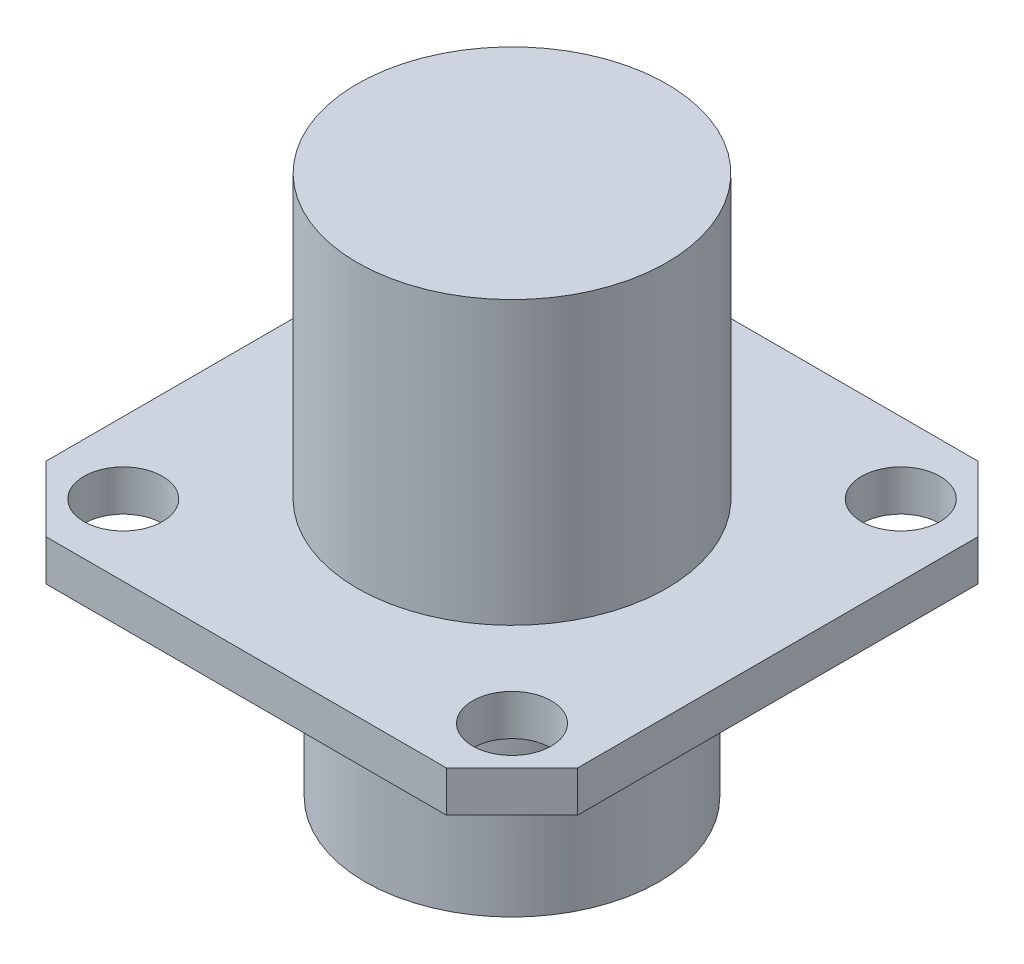
ISO-10303-21;
HEADER;
FILE_DESCRIPTION(('STEP AP214'),'2;1');
FILE_NAME('part.step','',(''),(''),'','','');
FILE_SCHEMA(('AUTOMOTIVE_DESIGN { 1 0 10303 214 1 1 1 1 }'));
ENDSEC;
DATA;
#1=APPLICATION_CONTEXT('core data for automotive mechanical design processes');
#2=APPLICATION_PROTOCOL_DEFINITION('international standard','automotive_design',2000,#1);
#3=PRODUCT_CONTEXT('',#1,'mechanical');
#4=PRODUCT('Part','Part','',(#3));
#5=PRODUCT_RELATED_PRODUCT_CATEGORY('part','',(#4));
#6=PRODUCT_DEFINITION_FORMATION('','',#4);
#7=PRODUCT_DEFINITION_CONTEXT('part definition',#1,'design');
#8=PRODUCT_DEFINITION('design','',#6,#7);
#9=PRODUCT_DEFINITION_SHAPE('','',#8);
#10=(LENGTH_UNIT() NAMED_UNIT(*) SI_UNIT(.MILLI.,.METRE.));
#11=(NAMED_UNIT(*) PLANE_ANGLE_UNIT() SI_UNIT($,.RADIAN.));
#12=(NAMED_UNIT(*) SI_UNIT($,.STERADIAN.) SOLID_ANGLE_UNIT());
#13=UNCERTAINTY_MEASURE_WITH_UNIT(LENGTH_MEASURE(1.E-05),#10,'distance_accuracy_value','');
#14=(GEOMETRIC_REPRESENTATION_CONTEXT(3) GLOBAL_UNCERTAINTY_ASSIGNED_CONTEXT((#13)) GLOBAL_UNIT_ASSIGNED_CONTEXT((#10,
#11,#12)) REPRESENTATION_CONTEXT('',''));
#15=CARTESIAN_POINT('',(0.,0.,0.));
#16=DIRECTION('',(0.,0.,1.));
#17=DIRECTION('',(1.,0.,0.));
#18=AXIS2_PLACEMENT_3D('',#15,#16,#17);
#19=CARTESIAN_POINT('',(10.3124,1.5875,-10.3124));
#20=DIRECTION('',(-1.,0.,0.));
#21=DIRECTION('',(0.,0.,1.));
#22=AXIS2_PLACEMENT_3D('',#19,#20,#21);
#23=PLANE('',#22);
#24=DIRECTION('',(0.,0.,-1.));
#25=VECTOR('',#24,1.);
#26=CARTESIAN_POINT('',(10.3124,0.,-10.3124));
#27=LINE('',#26,#25);
#28=CARTESIAN_POINT('',(10.3124,0.,7.7724));
#29=VERTEX_POINT('',#28);
#30=CARTESIAN_POINT('',(10.3124,0.,-7.77239999999999));
#31=VERTEX_POINT('',#30);
#32=EDGE_CURVE('E129',#29,#31,#27,.T.);
#33=ORIENTED_EDGE('',*,*,#32,.T.);
#34=DIRECTION('',(0.,1.,0.));
#35=VECTOR('',#34,1.);
#36=CARTESIAN_POINT('',(10.3124,1.5875,-7.77239999999999));
#37=LINE('',#36,#35);
#38=CARTESIAN_POINT('',(10.3124,1.5875,-7.77239999999999));
#39=VERTEX_POINT('',#38);
#40=EDGE_CURVE('E152',#31,#39,#37,.T.);
#41=ORIENTED_EDGE('',*,*,#40,.T.);
#42=DIRECTION('',(0.,0.,-1.));
#43=VECTOR('',#42,1.);
#44=CARTESIAN_POINT('',(10.3124,1.5875,-10.3124));
#45=LINE('',#44,#43);
#46=CARTESIAN_POINT('',(10.3124,1.5875,7.7724));
#47=VERTEX_POINT('',#46);
#48=EDGE_CURVE('E127',#47,#39,#45,.T.);
#49=ORIENTED_EDGE('',*,*,#48,.F.);
#50=DIRECTION('',(0.,-1.,0.));
#51=VECTOR('',#50,1.);
#52=CARTESIAN_POINT('',(10.3124,1.5875,7.7724));
#53=LINE('',#52,#51);
#54=EDGE_CURVE('E149',#47,#29,#53,.T.);
#55=ORIENTED_EDGE('',*,*,#54,.T.);
#56=EDGE_LOOP('',(#33,#41,#49,#55));
#57=FACE_BOUND('',#56,.T.);
#58=ADVANCED_FACE('F33',(#57),#23,.F.);
#59=CARTESIAN_POINT('',(-10.3124,1.5875,-10.3124));
#60=DIRECTION('',(0.,0.,1.));
#61=DIRECTION('',(1.,0.,0.));
#62=AXIS2_PLACEMENT_3D('',#59,#60,#61);
#63=PLANE('',#62);
#64=DIRECTION('',(-1.,0.,0.));
#65=VECTOR('',#64,1.);
#66=CARTESIAN_POINT('',(-10.3124,0.,-10.3124));
#67=LINE('',#66,#65);
#68=CARTESIAN_POINT('',(7.7724,0.,-10.3124));
#69=VERTEX_POINT('',#68);
#70=CARTESIAN_POINT('',(-7.77239999999999,0.,-10.3124));
#71=VERTEX_POINT('',#70);
#72=EDGE_CURVE('E125',#69,#71,#67,.T.);
#73=ORIENTED_EDGE('',*,*,#72,.T.);
#74=DIRECTION('',(0.,1.,0.));
#75=VECTOR('',#74,1.);
#76=CARTESIAN_POINT('',(-7.77239999999999,1.5875,-10.3124));
#77=LINE('',#76,#75);
#78=CARTESIAN_POINT('',(-7.77239999999999,1.5875,-10.3124));
#79=VERTEX_POINT('',#78);
#80=EDGE_CURVE('E104',#71,#79,#77,.T.);
#81=ORIENTED_EDGE('',*,*,#80,.T.);
#82=DIRECTION('',(-1.,0.,0.));
#83=VECTOR('',#82,1.);
#84=CARTESIAN_POINT('',(-10.3124,1.5875,-10.3124));
#85=LINE('',#84,#83);
#86=CARTESIAN_POINT('',(7.7724,1.5875,-10.3124));
#87=VERTEX_POINT('',#86);
#88=EDGE_CURVE('E170',#87,#79,#85,.T.);
#89=ORIENTED_EDGE('',*,*,#88,.F.);
#90=DIRECTION('',(0.,-1.,0.));
#91=VECTOR('',#90,1.);
#92=CARTESIAN_POINT('',(7.7724,1.5875,-10.3124));
#93=LINE('',#92,#91);
#94=EDGE_CURVE('E109',#87,#69,#93,.T.);
#95=ORIENTED_EDGE('',*,*,#94,.T.);
#96=EDGE_LOOP('',(#73,#81,#89,#95));
#97=FACE_BOUND('',#96,.T.);
#98=ADVANCED_FACE('F248',(#97),#63,.F.);
#99=CARTESIAN_POINT('',(-10.3124,1.5875,-10.3124));
#100=DIRECTION('',(1.,0.,0.));
#101=DIRECTION('',(0.,0.,-1.));
#102=AXIS2_PLACEMENT_3D('',#99,#100,#101);
#103=PLANE('',#102);
#104=DIRECTION('',(0.,0.,1.));
#105=VECTOR('',#104,1.);
#106=CARTESIAN_POINT('',(-10.3124,1.5875,-10.3124));
#107=LINE('',#106,#105);
#108=CARTESIAN_POINT('',(-10.3124,1.5875,-7.7724));
#109=VERTEX_POINT('',#108);
#110=CARTESIAN_POINT('',(-10.3124,1.5875,7.7724));
#111=VERTEX_POINT('',#110);
#112=EDGE_CURVE('E118',#109,#111,#107,.T.);
#113=ORIENTED_EDGE('',*,*,#112,.F.);
#114=DIRECTION('',(0.,-1.,0.));
#115=VECTOR('',#114,1.);
#116=CARTESIAN_POINT('',(-10.3124,1.5875,-7.7724));
#117=LINE('',#116,#115);
#118=CARTESIAN_POINT('',(-10.3124,0.,-7.7724));
#119=VERTEX_POINT('',#118);
#120=EDGE_CURVE('E103',#109,#119,#117,.T.);
#121=ORIENTED_EDGE('',*,*,#120,.T.);
#122=DIRECTION('',(0.,0.,1.));
#123=VECTOR('',#122,1.);
#124=CARTESIAN_POINT('',(-10.3124,0.,-10.3124));
#125=LINE('',#124,#123);
#126=CARTESIAN_POINT('',(-10.3124,0.,7.7724));
#127=VERTEX_POINT('',#126);
#128=EDGE_CURVE('E116',#119,#127,#125,.T.);
#129=ORIENTED_EDGE('',*,*,#128,.T.);
#130=DIRECTION('',(0.,1.,0.));
#131=VECTOR('',#130,1.);
#132=CARTESIAN_POINT('',(-10.3124,1.5875,7.7724));
#133=LINE('',#132,#131);
#134=EDGE_CURVE('E120',#127,#111,#133,.T.);
#135=ORIENTED_EDGE('',*,*,#134,.T.);
#136=EDGE_LOOP('',(#113,#121,#129,#135));
#137=FACE_BOUND('',#136,.T.);
#138=ADVANCED_FACE('F115',(#137),#103,.F.);
#139=CARTESIAN_POINT('',(-10.3124,1.5875,10.3124));
#140=DIRECTION('',(0.,0.,-1.));
#141=DIRECTION('',(-1.,0.,0.));
#142=AXIS2_PLACEMENT_3D('',#139,#140,#141);
#143=PLANE('',#142);
#144=DIRECTION('',(1.,0.,0.));
#145=VECTOR('',#144,1.);
#146=CARTESIAN_POINT('',(-10.3124,0.,10.3124));
#147=LINE('',#146,#145);
#148=CARTESIAN_POINT('',(-7.7724,0.,10.3124));
#149=VERTEX_POINT('',#148);
#150=CARTESIAN_POINT('',(7.77239999999999,0.,10.3124));
#151=VERTEX_POINT('',#150);
#152=EDGE_CURVE('E124',#149,#151,#147,.T.);
#153=ORIENTED_EDGE('',*,*,#152,.T.);
#154=DIRECTION('',(0.,1.,0.));
#155=VECTOR('',#154,1.);
#156=CARTESIAN_POINT('',(7.77239999999999,1.5875,10.3124));
#157=LINE('',#156,#155);
#158=CARTESIAN_POINT('',(7.77239999999999,1.5875,10.3124));
#159=VERTEX_POINT('',#158);
#160=EDGE_CURVE('E41',#151,#159,#157,.T.);
#161=ORIENTED_EDGE('',*,*,#160,.T.);
#162=DIRECTION('',(1.,0.,0.));
#163=VECTOR('',#162,1.);
#164=CARTESIAN_POINT('',(-10.3124,1.5875,10.3124));
#165=LINE('',#164,#163);
#166=CARTESIAN_POINT('',(-7.7724,1.5875,10.3124));
#167=VERTEX_POINT('',#166);
#168=EDGE_CURVE('E133',#167,#159,#165,.T.);
#169=ORIENTED_EDGE('',*,*,#168,.F.);
#170=DIRECTION('',(0.,-1.,0.));
#171=VECTOR('',#170,1.);
#172=CARTESIAN_POINT('',(-7.7724,1.5875,10.3124));
#173=LINE('',#172,#171);
#174=EDGE_CURVE('E154',#167,#149,#173,.T.);
#175=ORIENTED_EDGE('',*,*,#174,.T.);
#176=EDGE_LOOP('',(#153,#161,#169,#175));
#177=FACE_BOUND('',#176,.T.);
#178=ADVANCED_FACE('F157',(#177),#143,.F.);
#179=CARTESIAN_POINT('',(0.,1.5875,0.));
#180=DIRECTION('',(0.,1.,0.));
#181=DIRECTION('',(0.,0.,1.));
#182=AXIS2_PLACEMENT_3D('',#179,#180,#181);
#183=PLANE('',#182);
#184=CARTESIAN_POINT('',(0.,1.5875,0.));
#185=DIRECTION('',(0.,1.,0.));
#186=DIRECTION('',(0.,0.,1.));
#187=AXIS2_PLACEMENT_3D('',#184,#185,#186);
#188=CIRCLE('',#187,6.0071);
#189=CARTESIAN_POINT('',(0.,1.5875,6.0071));
#190=VERTEX_POINT('',#189);
#191=EDGE_CURVE('E204',#190,#190,#188,.T.);
#192=ORIENTED_EDGE('',*,*,#191,.F.);
#193=EDGE_LOOP('',(#192));
#194=FACE_BOUND('',#193,.T.);
#195=CARTESIAN_POINT('',(7.5438,1.5875,-7.5438));
#196=DIRECTION('',(0.,1.,0.));
#197=DIRECTION('',(0.,0.,1.));
#198=AXIS2_PLACEMENT_3D('',#195,#196,#197);
#199=CIRCLE('',#198,1.524);
#200=CARTESIAN_POINT('',(7.5438,1.5875,-6.0198));
#201=VERTEX_POINT('',#200);
#202=EDGE_CURVE('E199',#201,#201,#199,.T.);
#203=ORIENTED_EDGE('',*,*,#202,.F.);
#204=EDGE_LOOP('',(#203));
#205=FACE_BOUND('',#204,.T.);
#206=CARTESIAN_POINT('',(7.5438,1.5875,7.5438));
#207=DIRECTION('',(0.,1.,0.));
#208=DIRECTION('',(0.,0.,1.));
#209=AXIS2_PLACEMENT_3D('',#206,#207,#208);
#210=CIRCLE('',#209,1.524);
#211=CARTESIAN_POINT('',(7.5438,1.5875,9.0678));
#212=VERTEX_POINT('',#211);
#213=EDGE_CURVE('E193',#212,#212,#210,.T.);
#214=ORIENTED_EDGE('',*,*,#213,.F.);
#215=EDGE_LOOP('',(#214));
#216=FACE_BOUND('',#215,.T.);
#217=CARTESIAN_POINT('',(-7.5438,1.5875,7.5438));
#218=DIRECTION('',(0.,1.,0.));
#219=DIRECTION('',(0.,0.,1.));
#220=AXIS2_PLACEMENT_3D('',#217,#218,#219);
#221=CIRCLE('',#220,1.524);
#222=CARTESIAN_POINT('',(-7.5438,1.5875,9.0678));
#223=VERTEX_POINT('',#222);
#224=EDGE_CURVE('E186',#223,#223,#221,.T.);
#225=ORIENTED_EDGE('',*,*,#224,.F.);
#226=EDGE_LOOP('',(#225));
#227=FACE_BOUND('',#226,.T.);
#228=CARTESIAN_POINT('',(-7.5438,1.5875,-7.5438));
#229=DIRECTION('',(0.,1.,0.));
#230=DIRECTION('',(0.,0.,1.));
#231=AXIS2_PLACEMENT_3D('',#228,#229,#230);
#232=CIRCLE('',#231,1.524);
#233=CARTESIAN_POINT('',(-7.5438,1.5875,-6.0198));
#234=VERTEX_POINT('',#233);
#235=EDGE_CURVE('E175',#234,#234,#232,.T.);
#236=ORIENTED_EDGE('',*,*,#235,.F.);
#237=EDGE_LOOP('',(#236));
#238=FACE_BOUND('',#237,.T.);
#239=ORIENTED_EDGE('',*,*,#88,.T.);
#240=DIRECTION('',(0.707106781186549,0.,-0.707106781186546));
#241=VECTOR('',#240,1.);
#242=CARTESIAN_POINT('',(-9.04239999999998,1.5875,-9.04240000000002));
#243=LINE('',#242,#241);
#244=EDGE_CURVE('E147',#79,#109,#243,.F.);
#245=ORIENTED_EDGE('',*,*,#244,.T.);
#246=ORIENTED_EDGE('',*,*,#112,.T.);
#247=DIRECTION('',(-0.707106781186547,0.,-0.707106781186548));
#248=VECTOR('',#247,1.);
#249=CARTESIAN_POINT('',(-9.04240000000001,1.5875,9.04239999999999));
#250=LINE('',#249,#248);
#251=EDGE_CURVE('E54',#111,#167,#250,.F.);
#252=ORIENTED_EDGE('',*,*,#251,.T.);
#253=ORIENTED_EDGE('',*,*,#168,.T.);
#254=DIRECTION('',(-0.707106781186549,0.,0.707106781186546));
#255=VECTOR('',#254,1.);
#256=CARTESIAN_POINT('',(9.04239999999998,1.5875,9.04240000000002));
#257=LINE('',#256,#255);
#258=EDGE_CURVE('E143',#159,#47,#257,.F.);
#259=ORIENTED_EDGE('',*,*,#258,.T.);
#260=ORIENTED_EDGE('',*,*,#48,.T.);
#261=DIRECTION('',(0.707106781186546,0.,0.707106781186549));
#262=VECTOR('',#261,1.);
#263=CARTESIAN_POINT('',(9.04240000000002,1.5875,-9.04239999999998));
#264=LINE('',#263,#262);
#265=EDGE_CURVE('E145',#39,#87,#264,.F.);
#266=ORIENTED_EDGE('',*,*,#265,.T.);
#267=EDGE_LOOP('',(#239,#245,#246,#252,#253,#259,#260,#266));
#268=FACE_BOUND('',#267,.T.);
#269=ADVANCED_FACE('F224',(#194,#205,#216,#227,#238,#268),#183,.T.);
#270=CARTESIAN_POINT('',(0.,0.,0.));
#271=DIRECTION('',(0.,1.,0.));
#272=DIRECTION('',(0.,0.,1.));
#273=AXIS2_PLACEMENT_3D('',#270,#271,#272);
#274=PLANE('',#273);
#275=CARTESIAN_POINT('',(0.,0.,0.));
#276=DIRECTION('',(0.,1.,0.));
#277=DIRECTION('',(0.,0.,1.));
#278=AXIS2_PLACEMENT_3D('',#275,#276,#277);
#279=CIRCLE('',#278,5.7023);
#280=CARTESIAN_POINT('',(0.,0.,5.7023));
#281=VERTEX_POINT('',#280);
#282=EDGE_CURVE('E11',#281,#281,#279,.F.);
#283=ORIENTED_EDGE('',*,*,#282,.F.);
#284=EDGE_LOOP('',(#283));
#285=FACE_BOUND('',#284,.T.);
#286=CARTESIAN_POINT('',(7.5438,0.,-7.5438));
#287=DIRECTION('',(0.,1.,0.));
#288=DIRECTION('',(0.,0.,1.));
#289=AXIS2_PLACEMENT_3D('',#286,#287,#288);
#290=CIRCLE('',#289,1.524);
#291=CARTESIAN_POINT('',(7.5438,0.,-6.0198));
#292=VERTEX_POINT('',#291);
#293=EDGE_CURVE('E184',#292,#292,#290,.T.);
#294=ORIENTED_EDGE('',*,*,#293,.T.);
#295=EDGE_LOOP('',(#294));
#296=FACE_BOUND('',#295,.T.);
#297=CARTESIAN_POINT('',(7.5438,0.,7.5438));
#298=DIRECTION('',(0.,1.,0.));
#299=DIRECTION('',(0.,0.,1.));
#300=AXIS2_PLACEMENT_3D('',#297,#298,#299);
#301=CIRCLE('',#300,1.524);
#302=CARTESIAN_POINT('',(7.5438,0.,9.0678));
#303=VERTEX_POINT('',#302);
#304=EDGE_CURVE('E196',#303,#303,#301,.T.);
#305=ORIENTED_EDGE('',*,*,#304,.T.);
#306=EDGE_LOOP('',(#305));
#307=FACE_BOUND('',#306,.T.);
#308=CARTESIAN_POINT('',(-7.5438,0.,7.5438));
#309=DIRECTION('',(0.,1.,0.));
#310=DIRECTION('',(0.,0.,1.));
#311=AXIS2_PLACEMENT_3D('',#308,#309,#310);
#312=CIRCLE('',#311,1.524);
#313=CARTESIAN_POINT('',(-7.5438,0.,9.0678));
#314=VERTEX_POINT('',#313);
#315=EDGE_CURVE('E189',#314,#314,#312,.T.);
#316=ORIENTED_EDGE('',*,*,#315,.T.);
#317=EDGE_LOOP('',(#316));
#318=FACE_BOUND('',#317,.T.);
#319=CARTESIAN_POINT('',(-7.5438,0.,-7.5438));
#320=DIRECTION('',(0.,1.,0.));
#321=DIRECTION('',(0.,0.,1.));
#322=AXIS2_PLACEMENT_3D('',#319,#320,#321);
#323=CIRCLE('',#322,1.524);
#324=CARTESIAN_POINT('',(-7.5438,0.,-6.0198));
#325=VERTEX_POINT('',#324);
#326=EDGE_CURVE('E179',#325,#325,#323,.T.);
#327=ORIENTED_EDGE('',*,*,#326,.T.);
#328=EDGE_LOOP('',(#327));
#329=FACE_BOUND('',#328,.T.);
#330=ORIENTED_EDGE('',*,*,#128,.F.);
#331=DIRECTION('',(-0.707106781186549,0.,0.707106781186546));
#332=VECTOR('',#331,1.);
#333=CARTESIAN_POINT('',(-10.3124,0.,-7.7724));
#334=LINE('',#333,#332);
#335=EDGE_CURVE('E99',#119,#71,#334,.F.);
#336=ORIENTED_EDGE('',*,*,#335,.T.);
#337=ORIENTED_EDGE('',*,*,#72,.F.);
#338=DIRECTION('',(-0.707106781186546,0.,-0.707106781186549));
#339=VECTOR('',#338,1.);
#340=CARTESIAN_POINT('',(7.7724,0.,-10.3124));
#341=LINE('',#340,#339);
#342=EDGE_CURVE('E110',#69,#31,#341,.F.);
#343=ORIENTED_EDGE('',*,*,#342,.T.);
#344=ORIENTED_EDGE('',*,*,#32,.F.);
#345=DIRECTION('',(0.707106781186549,0.,-0.707106781186546));
#346=VECTOR('',#345,1.);
#347=CARTESIAN_POINT('',(10.3124,0.,7.7724));
#348=LINE('',#347,#346);
#349=EDGE_CURVE('E136',#29,#151,#348,.F.);
#350=ORIENTED_EDGE('',*,*,#349,.T.);
#351=ORIENTED_EDGE('',*,*,#152,.F.);
#352=DIRECTION('',(0.707106781186547,0.,0.707106781186548));
#353=VECTOR('',#352,1.);
#354=CARTESIAN_POINT('',(-7.7724,0.,10.3124));
#355=LINE('',#354,#353);
#356=EDGE_CURVE('E119',#149,#127,#355,.F.);
#357=ORIENTED_EDGE('',*,*,#356,.T.);
#358=EDGE_LOOP('',(#330,#336,#337,#343,#344,#350,#351,#357));
#359=FACE_BOUND('',#358,.T.);
#360=ADVANCED_FACE('F122',(#285,#296,#307,#318,#329,#359),#274,.F.);
#361=CARTESIAN_POINT('',(-10.3124,1.5875,-7.7724));
#362=DIRECTION('',(0.707106781186546,0.,0.707106781186549));
#363=DIRECTION('',(0.,-1.,0.));
#364=AXIS2_PLACEMENT_3D('',#361,#362,#363);
#365=PLANE('',#364);
#366=ORIENTED_EDGE('',*,*,#244,.F.);
#367=ORIENTED_EDGE('',*,*,#80,.F.);
#368=ORIENTED_EDGE('',*,*,#335,.F.);
#369=ORIENTED_EDGE('',*,*,#120,.F.);
#370=EDGE_LOOP('',(#366,#367,#368,#369));
#371=FACE_BOUND('',#370,.T.);
#372=ADVANCED_FACE('F102',(#371),#365,.F.);
#373=CARTESIAN_POINT('',(7.7724,1.5875,-10.3124));
#374=DIRECTION('',(-0.707106781186549,0.,0.707106781186546));
#375=DIRECTION('',(0.,-1.,0.));
#376=AXIS2_PLACEMENT_3D('',#373,#374,#375);
#377=PLANE('',#376);
#378=ORIENTED_EDGE('',*,*,#265,.F.);
#379=ORIENTED_EDGE('',*,*,#40,.F.);
#380=ORIENTED_EDGE('',*,*,#342,.F.);
#381=ORIENTED_EDGE('',*,*,#94,.F.);
#382=EDGE_LOOP('',(#378,#379,#380,#381));
#383=FACE_BOUND('',#382,.T.);
#384=ADVANCED_FACE('F250',(#383),#377,.F.);
#385=CARTESIAN_POINT('',(10.3124,1.5875,7.7724));
#386=DIRECTION('',(-0.707106781186546,0.,-0.707106781186549));
#387=DIRECTION('',(0.,-1.,0.));
#388=AXIS2_PLACEMENT_3D('',#385,#386,#387);
#389=PLANE('',#388);
#390=ORIENTED_EDGE('',*,*,#258,.F.);
#391=ORIENTED_EDGE('',*,*,#160,.F.);
#392=ORIENTED_EDGE('',*,*,#349,.F.);
#393=ORIENTED_EDGE('',*,*,#54,.F.);
#394=EDGE_LOOP('',(#390,#391,#392,#393));
#395=FACE_BOUND('',#394,.T.);
#396=ADVANCED_FACE('F164',(#395),#389,.F.);
#397=CARTESIAN_POINT('',(-7.7724,1.5875,10.3124));
#398=DIRECTION('',(0.707106781186548,0.,-0.707106781186547));
#399=DIRECTION('',(0.,-1.,0.));
#400=AXIS2_PLACEMENT_3D('',#397,#398,#399);
#401=PLANE('',#400);
#402=ORIENTED_EDGE('',*,*,#251,.F.);
#403=ORIENTED_EDGE('',*,*,#134,.F.);
#404=ORIENTED_EDGE('',*,*,#356,.F.);
#405=ORIENTED_EDGE('',*,*,#174,.F.);
#406=EDGE_LOOP('',(#402,#403,#404,#405));
#407=FACE_BOUND('',#406,.T.);
#408=ADVANCED_FACE('F35',(#407),#401,.F.);
#409=CARTESIAN_POINT('',(-7.5438,0.,-7.5438));
#410=DIRECTION('',(0.,1.,0.));
#411=DIRECTION('',(0.,0.,1.));
#412=AXIS2_PLACEMENT_3D('',#409,#410,#411);
#413=CYLINDRICAL_SURFACE('',#412,1.524);
#414=ORIENTED_EDGE('',*,*,#326,.F.);
#415=EDGE_LOOP('',(#414));
#416=FACE_BOUND('',#415,.T.);
#417=ORIENTED_EDGE('',*,*,#235,.T.);
#418=EDGE_LOOP('',(#417));
#419=FACE_BOUND('',#418,.T.);
#420=ADVANCED_FACE('F236',(#416,#419),#413,.F.);
#421=CARTESIAN_POINT('',(-7.5438,0.,7.5438));
#422=DIRECTION('',(0.,1.,0.));
#423=DIRECTION('',(0.,0.,1.));
#424=AXIS2_PLACEMENT_3D('',#421,#422,#423);
#425=CYLINDRICAL_SURFACE('',#424,1.524);
#426=ORIENTED_EDGE('',*,*,#315,.F.);
#427=EDGE_LOOP('',(#426));
#428=FACE_BOUND('',#427,.T.);
#429=ORIENTED_EDGE('',*,*,#224,.T.);
#430=EDGE_LOOP('',(#429));
#431=FACE_BOUND('',#430,.T.);
#432=ADVANCED_FACE('F232',(#428,#431),#425,.F.);
#433=CARTESIAN_POINT('',(7.5438,0.,7.5438));
#434=DIRECTION('',(0.,1.,0.));
#435=DIRECTION('',(0.,0.,1.));
#436=AXIS2_PLACEMENT_3D('',#433,#434,#435);
#437=CYLINDRICAL_SURFACE('',#436,1.524);
#438=ORIENTED_EDGE('',*,*,#304,.F.);
#439=EDGE_LOOP('',(#438));
#440=FACE_BOUND('',#439,.T.);
#441=ORIENTED_EDGE('',*,*,#213,.T.);
#442=EDGE_LOOP('',(#441));
#443=FACE_BOUND('',#442,.T.);
#444=ADVANCED_FACE('F235',(#440,#443),#437,.F.);
#445=CARTESIAN_POINT('',(7.5438,0.,-7.5438));
#446=DIRECTION('',(0.,1.,0.));
#447=DIRECTION('',(0.,0.,1.));
#448=AXIS2_PLACEMENT_3D('',#445,#446,#447);
#449=CYLINDRICAL_SURFACE('',#448,1.524);
#450=ORIENTED_EDGE('',*,*,#293,.F.);
#451=EDGE_LOOP('',(#450));
#452=FACE_BOUND('',#451,.T.);
#453=ORIENTED_EDGE('',*,*,#202,.T.);
#454=EDGE_LOOP('',(#453));
#455=FACE_BOUND('',#454,.T.);
#456=ADVANCED_FACE('F274',(#452,#455),#449,.F.);
#457=CARTESIAN_POINT('',(0.,12.5349,0.));
#458=DIRECTION('',(0.,-1.,0.));
#459=DIRECTION('',(0.,0.,-1.));
#460=AXIS2_PLACEMENT_3D('',#457,#458,#459);
#461=CYLINDRICAL_SURFACE('',#460,6.0071);
#462=CARTESIAN_POINT('',(0.,12.5349,0.));
#463=DIRECTION('',(0.,1.,0.));
#464=DIRECTION('',(0.,0.,1.));
#465=AXIS2_PLACEMENT_3D('',#462,#463,#464);
#466=CIRCLE('',#465,6.0071);
#467=CARTESIAN_POINT('',(0.,12.5349,6.0071));
#468=VERTEX_POINT('',#467);
#469=EDGE_CURVE('E190',#468,#468,#466,.T.);
#470=ORIENTED_EDGE('',*,*,#469,.F.);
#471=EDGE_LOOP('',(#470));
#472=FACE_BOUND('',#471,.T.);
#473=ORIENTED_EDGE('',*,*,#191,.T.);
#474=EDGE_LOOP('',(#473));
#475=FACE_BOUND('',#474,.T.);
#476=ADVANCED_FACE('F278',(#472,#475),#461,.T.);
#477=CARTESIAN_POINT('',(0.,12.5349,0.));
#478=DIRECTION('',(0.,1.,0.));
#479=DIRECTION('',(0.,0.,1.));
#480=AXIS2_PLACEMENT_3D('',#477,#478,#479);
#481=PLANE('',#480);
#482=ORIENTED_EDGE('',*,*,#469,.T.);
#483=EDGE_LOOP('',(#482));
#484=FACE_BOUND('',#483,.T.);
#485=ADVANCED_FACE('F218',(#484),#481,.T.);
#486=CARTESIAN_POINT('',(0.,-8.4328,0.));
#487=DIRECTION('',(0.,1.,0.));
#488=DIRECTION('',(0.,0.,1.));
#489=AXIS2_PLACEMENT_3D('',#486,#487,#488);
#490=CYLINDRICAL_SURFACE('',#489,5.7023);
#491=CARTESIAN_POINT('',(0.,-8.4328,0.));
#492=DIRECTION('',(0.,-1.,0.));
#493=DIRECTION('',(0.,0.,-1.));
#494=AXIS2_PLACEMENT_3D('',#491,#492,#493);
#495=CIRCLE('',#494,5.7023);
#496=CARTESIAN_POINT('',(0.,-8.4328,-5.7023));
#497=VERTEX_POINT('',#496);
#498=EDGE_CURVE('E207',#497,#497,#495,.T.);
#499=ORIENTED_EDGE('',*,*,#498,.F.);
#500=EDGE_LOOP('',(#499));
#501=FACE_BOUND('',#500,.T.);
#502=ORIENTED_EDGE('',*,*,#282,.T.);
#503=EDGE_LOOP('',(#502));
#504=FACE_BOUND('',#503,.T.);
#505=ADVANCED_FACE('F215',(#501,#504),#490,.T.);
#506=CARTESIAN_POINT('',(0.,-8.4328,0.));
#507=DIRECTION('',(0.,-1.,0.));
#508=DIRECTION('',(0.,0.,-1.));
#509=AXIS2_PLACEMENT_3D('',#506,#507,#508);
#510=PLANE('',#509);
#511=ORIENTED_EDGE('',*,*,#498,.T.);
#512=EDGE_LOOP('',(#511));
#513=FACE_BOUND('',#512,.T.);
#514=ADVANCED_FACE('F213',(#513),#510,.T.);
#515=CLOSED_SHELL('',(#58,#98,#138,#178,#269,#360,#372,#384,#396,#408,#420,#432,#444,#456,#476,
#485,#505,#514));
#516=MANIFOLD_SOLID_BREP('B2',#515);
#517=ADVANCED_BREP_SHAPE_REPRESENTATION('',(#18,#516),#14);
#518=SHAPE_DEFINITION_REPRESENTATION(#9,#517);
ENDSEC;
END-ISO-10303-21;
